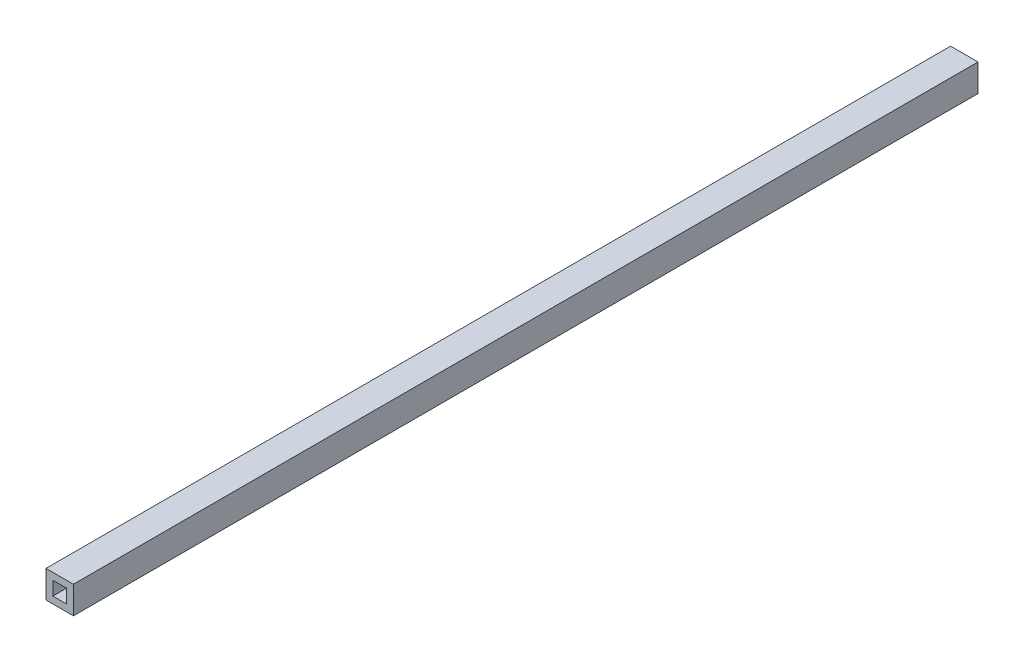
ISO-10303-21;
HEADER;
FILE_DESCRIPTION(('STEP AP214'),'2;1');
FILE_NAME('part.step','',(''),(''),'','','');
FILE_SCHEMA(('AUTOMOTIVE_DESIGN { 1 0 10303 214 1 1 1 1 }'));
ENDSEC;
DATA;
#1=APPLICATION_CONTEXT('core data for automotive mechanical design processes');
#2=APPLICATION_PROTOCOL_DEFINITION('international standard','automotive_design',2000,#1);
#3=PRODUCT_CONTEXT('',#1,'mechanical');
#4=PRODUCT('Part','Part','',(#3));
#5=PRODUCT_RELATED_PRODUCT_CATEGORY('part','',(#4));
#6=PRODUCT_DEFINITION_FORMATION('','',#4);
#7=PRODUCT_DEFINITION_CONTEXT('part definition',#1,'design');
#8=PRODUCT_DEFINITION('design','',#6,#7);
#9=PRODUCT_DEFINITION_SHAPE('','',#8);
#10=(LENGTH_UNIT() NAMED_UNIT(*) SI_UNIT(.MILLI.,.METRE.));
#11=(NAMED_UNIT(*) PLANE_ANGLE_UNIT() SI_UNIT($,.RADIAN.));
#12=(NAMED_UNIT(*) SI_UNIT($,.STERADIAN.) SOLID_ANGLE_UNIT());
#13=UNCERTAINTY_MEASURE_WITH_UNIT(LENGTH_MEASURE(1.E-05),#10,'distance_accuracy_value','');
#14=(GEOMETRIC_REPRESENTATION_CONTEXT(3) GLOBAL_UNCERTAINTY_ASSIGNED_CONTEXT((#13)) GLOBAL_UNIT_ASSIGNED_CONTEXT((#10,
#11,#12)) REPRESENTATION_CONTEXT('',''));
#15=CARTESIAN_POINT('',(0.,0.,0.));
#16=DIRECTION('',(0.,0.,1.));
#17=DIRECTION('',(1.,0.,0.));
#18=AXIS2_PLACEMENT_3D('',#15,#16,#17);
#19=CARTESIAN_POINT('',(0.,0.,660.));
#20=DIRECTION('',(0.,0.,1.));
#21=DIRECTION('',(1.,0.,0.));
#22=AXIS2_PLACEMENT_3D('',#19,#20,#21);
#23=PLANE('',#22);
#24=DIRECTION('',(0.,1.,0.));
#25=VECTOR('',#24,1.);
#26=CARTESIAN_POINT('',(10.,-10.,660.));
#27=LINE('',#26,#25);
#28=CARTESIAN_POINT('',(10.,-10.,660.));
#29=VERTEX_POINT('',#28);
#30=CARTESIAN_POINT('',(10.,10.,660.));
#31=VERTEX_POINT('',#30);
#32=EDGE_CURVE('E158',#29,#31,#27,.T.);
#33=ORIENTED_EDGE('',*,*,#32,.T.);
#34=DIRECTION('',(-1.,0.,0.));
#35=VECTOR('',#34,1.);
#36=CARTESIAN_POINT('',(-10.,10.,660.));
#37=LINE('',#36,#35);
#38=CARTESIAN_POINT('',(-10.,10.,660.));
#39=VERTEX_POINT('',#38);
#40=EDGE_CURVE('E161',#31,#39,#37,.T.);
#41=ORIENTED_EDGE('',*,*,#40,.T.);
#42=DIRECTION('',(0.,-1.,0.));
#43=VECTOR('',#42,1.);
#44=CARTESIAN_POINT('',(-10.,-10.,660.));
#45=LINE('',#44,#43);
#46=CARTESIAN_POINT('',(-10.,-10.,660.));
#47=VERTEX_POINT('',#46);
#48=EDGE_CURVE('E164',#39,#47,#45,.T.);
#49=ORIENTED_EDGE('',*,*,#48,.T.);
#50=DIRECTION('',(1.,0.,0.));
#51=VECTOR('',#50,1.);
#52=CARTESIAN_POINT('',(-10.,-10.,660.));
#53=LINE('',#52,#51);
#54=EDGE_CURVE('E166',#47,#29,#53,.T.);
#55=ORIENTED_EDGE('',*,*,#54,.T.);
#56=EDGE_LOOP('',(#33,#41,#49,#55));
#57=FACE_BOUND('',#56,.T.);
#58=DIRECTION('',(-1.,0.,0.));
#59=VECTOR('',#58,1.);
#60=CARTESIAN_POINT('',(0.,5.,660.));
#61=LINE('',#60,#59);
#62=CARTESIAN_POINT('',(5.,5.,660.));
#63=VERTEX_POINT('',#62);
#64=CARTESIAN_POINT('',(-5.,5.,660.));
#65=VERTEX_POINT('',#64);
#66=EDGE_CURVE('E130',#63,#65,#61,.T.);
#67=ORIENTED_EDGE('',*,*,#66,.F.);
#68=DIRECTION('',(0.,1.,0.));
#69=VECTOR('',#68,1.);
#70=CARTESIAN_POINT('',(5.,0.,660.));
#71=LINE('',#70,#69);
#72=CARTESIAN_POINT('',(5.,-5.,660.));
#73=VERTEX_POINT('',#72);
#74=EDGE_CURVE('E122',#73,#63,#71,.T.);
#75=ORIENTED_EDGE('',*,*,#74,.F.);
#76=DIRECTION('',(1.,0.,0.));
#77=VECTOR('',#76,1.);
#78=CARTESIAN_POINT('',(0.,-5.,660.));
#79=LINE('',#78,#77);
#80=CARTESIAN_POINT('',(-5.,-5.,660.));
#81=VERTEX_POINT('',#80);
#82=EDGE_CURVE('E144',#81,#73,#79,.T.);
#83=ORIENTED_EDGE('',*,*,#82,.F.);
#84=DIRECTION('',(0.,-1.,0.));
#85=VECTOR('',#84,1.);
#86=CARTESIAN_POINT('',(-5.,0.,660.));
#87=LINE('',#86,#85);
#88=EDGE_CURVE('E142',#65,#81,#87,.T.);
#89=ORIENTED_EDGE('',*,*,#88,.F.);
#90=EDGE_LOOP('',(#67,#75,#83,#89));
#91=FACE_BOUND('',#90,.T.);
#92=ADVANCED_FACE('F57',(#57,#91),#23,.T.);
#93=CARTESIAN_POINT('',(0.,0.,0.));
#94=DIRECTION('',(0.,0.,1.));
#95=DIRECTION('',(1.,0.,0.));
#96=AXIS2_PLACEMENT_3D('',#93,#94,#95);
#97=PLANE('',#96);
#98=DIRECTION('',(0.,1.,0.));
#99=VECTOR('',#98,1.);
#100=CARTESIAN_POINT('',(10.,-10.,0.));
#101=LINE('',#100,#99);
#102=CARTESIAN_POINT('',(10.,-10.,0.));
#103=VERTEX_POINT('',#102);
#104=CARTESIAN_POINT('',(10.,10.,0.));
#105=VERTEX_POINT('',#104);
#106=EDGE_CURVE('E138',#103,#105,#101,.T.);
#107=ORIENTED_EDGE('',*,*,#106,.F.);
#108=DIRECTION('',(1.,0.,0.));
#109=VECTOR('',#108,1.);
#110=CARTESIAN_POINT('',(-10.,-10.,0.));
#111=LINE('',#110,#109);
#112=CARTESIAN_POINT('',(-10.,-10.,0.));
#113=VERTEX_POINT('',#112);
#114=EDGE_CURVE('E162',#113,#103,#111,.T.);
#115=ORIENTED_EDGE('',*,*,#114,.F.);
#116=DIRECTION('',(0.,-1.,0.));
#117=VECTOR('',#116,1.);
#118=CARTESIAN_POINT('',(-10.,-10.,0.));
#119=LINE('',#118,#117);
#120=CARTESIAN_POINT('',(-10.,10.,0.));
#121=VERTEX_POINT('',#120);
#122=EDGE_CURVE('E173',#121,#113,#119,.T.);
#123=ORIENTED_EDGE('',*,*,#122,.F.);
#124=DIRECTION('',(-1.,0.,0.));
#125=VECTOR('',#124,1.);
#126=CARTESIAN_POINT('',(-10.,10.,0.));
#127=LINE('',#126,#125);
#128=EDGE_CURVE('E171',#105,#121,#127,.T.);
#129=ORIENTED_EDGE('',*,*,#128,.F.);
#130=EDGE_LOOP('',(#107,#115,#123,#129));
#131=FACE_BOUND('',#130,.T.);
#132=DIRECTION('',(0.,1.,0.));
#133=VECTOR('',#132,1.);
#134=CARTESIAN_POINT('',(5.,0.,0.));
#135=LINE('',#134,#133);
#136=CARTESIAN_POINT('',(5.,-5.,0.));
#137=VERTEX_POINT('',#136);
#138=CARTESIAN_POINT('',(5.,5.,0.));
#139=VERTEX_POINT('',#138);
#140=EDGE_CURVE('E80',#137,#139,#135,.T.);
#141=ORIENTED_EDGE('',*,*,#140,.T.);
#142=DIRECTION('',(-1.,0.,0.));
#143=VECTOR('',#142,1.);
#144=CARTESIAN_POINT('',(0.,5.,0.));
#145=LINE('',#144,#143);
#146=CARTESIAN_POINT('',(-5.,5.,0.));
#147=VERTEX_POINT('',#146);
#148=EDGE_CURVE('E137',#139,#147,#145,.T.);
#149=ORIENTED_EDGE('',*,*,#148,.T.);
#150=DIRECTION('',(0.,-1.,0.));
#151=VECTOR('',#150,1.);
#152=CARTESIAN_POINT('',(-5.,0.,0.));
#153=LINE('',#152,#151);
#154=CARTESIAN_POINT('',(-5.,-5.,0.));
#155=VERTEX_POINT('',#154);
#156=EDGE_CURVE('E150',#147,#155,#153,.T.);
#157=ORIENTED_EDGE('',*,*,#156,.T.);
#158=DIRECTION('',(1.,0.,0.));
#159=VECTOR('',#158,1.);
#160=CARTESIAN_POINT('',(0.,-5.,0.));
#161=LINE('',#160,#159);
#162=EDGE_CURVE('E131',#155,#137,#161,.T.);
#163=ORIENTED_EDGE('',*,*,#162,.T.);
#164=EDGE_LOOP('',(#141,#149,#157,#163));
#165=FACE_BOUND('',#164,.T.);
#166=ADVANCED_FACE('F191',(#131,#165),#97,.F.);
#167=CARTESIAN_POINT('',(10.,-10.,660.));
#168=DIRECTION('',(-1.,0.,0.));
#169=DIRECTION('',(0.,0.,1.));
#170=AXIS2_PLACEMENT_3D('',#167,#168,#169);
#171=PLANE('',#170);
#172=ORIENTED_EDGE('',*,*,#106,.T.);
#173=DIRECTION('',(0.,0.,-1.));
#174=VECTOR('',#173,1.);
#175=CARTESIAN_POINT('',(10.,10.,660.));
#176=LINE('',#175,#174);
#177=EDGE_CURVE('E12',#31,#105,#176,.T.);
#178=ORIENTED_EDGE('',*,*,#177,.F.);
#179=ORIENTED_EDGE('',*,*,#32,.F.);
#180=DIRECTION('',(0.,0.,-1.));
#181=VECTOR('',#180,1.);
#182=CARTESIAN_POINT('',(10.,-10.,660.));
#183=LINE('',#182,#181);
#184=EDGE_CURVE('E168',#29,#103,#183,.T.);
#185=ORIENTED_EDGE('',*,*,#184,.T.);
#186=EDGE_LOOP('',(#172,#178,#179,#185));
#187=FACE_BOUND('',#186,.T.);
#188=ADVANCED_FACE('F59',(#187),#171,.F.);
#189=CARTESIAN_POINT('',(-10.,10.,660.));
#190=DIRECTION('',(0.,-1.,0.));
#191=DIRECTION('',(0.,0.,-1.));
#192=AXIS2_PLACEMENT_3D('',#189,#190,#191);
#193=PLANE('',#192);
#194=ORIENTED_EDGE('',*,*,#128,.T.);
#195=DIRECTION('',(0.,0.,-1.));
#196=VECTOR('',#195,1.);
#197=CARTESIAN_POINT('',(-10.,10.,660.));
#198=LINE('',#197,#196);
#199=EDGE_CURVE('E65',#39,#121,#198,.T.);
#200=ORIENTED_EDGE('',*,*,#199,.F.);
#201=ORIENTED_EDGE('',*,*,#40,.F.);
#202=ORIENTED_EDGE('',*,*,#177,.T.);
#203=EDGE_LOOP('',(#194,#200,#201,#202));
#204=FACE_BOUND('',#203,.T.);
#205=ADVANCED_FACE('F201',(#204),#193,.F.);
#206=CARTESIAN_POINT('',(-10.,-10.,660.));
#207=DIRECTION('',(1.,0.,0.));
#208=DIRECTION('',(0.,0.,-1.));
#209=AXIS2_PLACEMENT_3D('',#206,#207,#208);
#210=PLANE('',#209);
#211=ORIENTED_EDGE('',*,*,#122,.T.);
#212=DIRECTION('',(0.,0.,-1.));
#213=VECTOR('',#212,1.);
#214=CARTESIAN_POINT('',(-10.,-10.,660.));
#215=LINE('',#214,#213);
#216=EDGE_CURVE('E178',#47,#113,#215,.T.);
#217=ORIENTED_EDGE('',*,*,#216,.F.);
#218=ORIENTED_EDGE('',*,*,#48,.F.);
#219=ORIENTED_EDGE('',*,*,#199,.T.);
#220=EDGE_LOOP('',(#211,#217,#218,#219));
#221=FACE_BOUND('',#220,.T.);
#222=ADVANCED_FACE('F185',(#221),#210,.F.);
#223=CARTESIAN_POINT('',(-10.,-10.,660.));
#224=DIRECTION('',(0.,1.,0.));
#225=DIRECTION('',(0.,0.,1.));
#226=AXIS2_PLACEMENT_3D('',#223,#224,#225);
#227=PLANE('',#226);
#228=ORIENTED_EDGE('',*,*,#114,.T.);
#229=ORIENTED_EDGE('',*,*,#184,.F.);
#230=ORIENTED_EDGE('',*,*,#54,.F.);
#231=ORIENTED_EDGE('',*,*,#216,.T.);
#232=EDGE_LOOP('',(#228,#229,#230,#231));
#233=FACE_BOUND('',#232,.T.);
#234=ADVANCED_FACE('F195',(#233),#227,.F.);
#235=CARTESIAN_POINT('',(5.,0.,660.));
#236=DIRECTION('',(-1.,0.,0.));
#237=DIRECTION('',(0.,0.,1.));
#238=AXIS2_PLACEMENT_3D('',#235,#236,#237);
#239=PLANE('',#238);
#240=ORIENTED_EDGE('',*,*,#140,.F.);
#241=DIRECTION('',(0.,0.,-1.));
#242=VECTOR('',#241,1.);
#243=CARTESIAN_POINT('',(5.,-5.,660.));
#244=LINE('',#243,#242);
#245=EDGE_CURVE('E126',#73,#137,#244,.T.);
#246=ORIENTED_EDGE('',*,*,#245,.F.);
#247=ORIENTED_EDGE('',*,*,#74,.T.);
#248=DIRECTION('',(0.,0.,-1.));
#249=VECTOR('',#248,1.);
#250=CARTESIAN_POINT('',(5.,5.,660.));
#251=LINE('',#250,#249);
#252=EDGE_CURVE('E125',#63,#139,#251,.T.);
#253=ORIENTED_EDGE('',*,*,#252,.T.);
#254=EDGE_LOOP('',(#240,#246,#247,#253));
#255=FACE_BOUND('',#254,.T.);
#256=ADVANCED_FACE('F124',(#255),#239,.T.);
#257=CARTESIAN_POINT('',(0.,5.,660.));
#258=DIRECTION('',(0.,-1.,0.));
#259=DIRECTION('',(0.,0.,-1.));
#260=AXIS2_PLACEMENT_3D('',#257,#258,#259);
#261=PLANE('',#260);
#262=ORIENTED_EDGE('',*,*,#148,.F.);
#263=ORIENTED_EDGE('',*,*,#252,.F.);
#264=ORIENTED_EDGE('',*,*,#66,.T.);
#265=DIRECTION('',(0.,0.,-1.));
#266=VECTOR('',#265,1.);
#267=CARTESIAN_POINT('',(-5.,5.,660.));
#268=LINE('',#267,#266);
#269=EDGE_CURVE('E139',#65,#147,#268,.T.);
#270=ORIENTED_EDGE('',*,*,#269,.T.);
#271=EDGE_LOOP('',(#262,#263,#264,#270));
#272=FACE_BOUND('',#271,.T.);
#273=ADVANCED_FACE('F134',(#272),#261,.T.);
#274=CARTESIAN_POINT('',(-5.,0.,660.));
#275=DIRECTION('',(1.,0.,0.));
#276=DIRECTION('',(0.,0.,-1.));
#277=AXIS2_PLACEMENT_3D('',#274,#275,#276);
#278=PLANE('',#277);
#279=ORIENTED_EDGE('',*,*,#156,.F.);
#280=ORIENTED_EDGE('',*,*,#269,.F.);
#281=ORIENTED_EDGE('',*,*,#88,.T.);
#282=DIRECTION('',(0.,0.,-1.));
#283=VECTOR('',#282,1.);
#284=CARTESIAN_POINT('',(-5.,-5.,660.));
#285=LINE('',#284,#283);
#286=EDGE_CURVE('E72',#81,#155,#285,.T.);
#287=ORIENTED_EDGE('',*,*,#286,.T.);
#288=EDGE_LOOP('',(#279,#280,#281,#287));
#289=FACE_BOUND('',#288,.T.);
#290=ADVANCED_FACE('F224',(#289),#278,.T.);
#291=CARTESIAN_POINT('',(0.,-5.,660.));
#292=DIRECTION('',(0.,1.,0.));
#293=DIRECTION('',(0.,0.,1.));
#294=AXIS2_PLACEMENT_3D('',#291,#292,#293);
#295=PLANE('',#294);
#296=ORIENTED_EDGE('',*,*,#162,.F.);
#297=ORIENTED_EDGE('',*,*,#286,.F.);
#298=ORIENTED_EDGE('',*,*,#82,.T.);
#299=ORIENTED_EDGE('',*,*,#245,.T.);
#300=EDGE_LOOP('',(#296,#297,#298,#299));
#301=FACE_BOUND('',#300,.T.);
#302=ADVANCED_FACE('F228',(#301),#295,.T.);
#303=CLOSED_SHELL('',(#92,#166,#188,#205,#222,#234,#256,#273,#290,#302));
#304=MANIFOLD_SOLID_BREP('B2',#303);
#305=ADVANCED_BREP_SHAPE_REPRESENTATION('',(#18,#304),#14);
#306=SHAPE_DEFINITION_REPRESENTATION(#9,#305);
ENDSEC;
END-ISO-10303-21;
